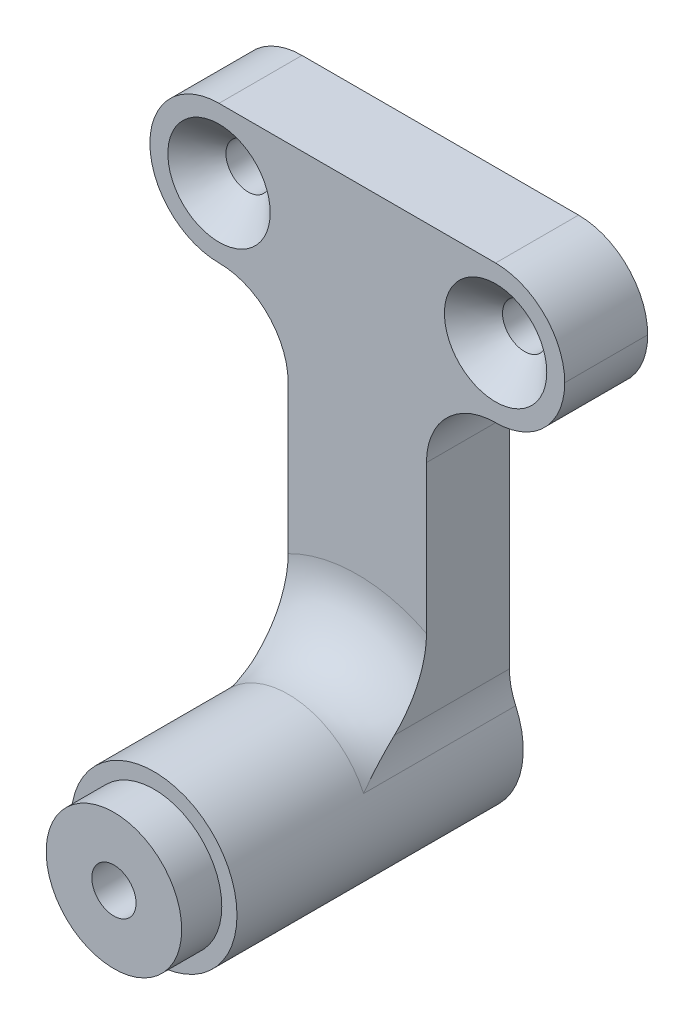
ISO-10303-21;
HEADER;
FILE_DESCRIPTION(('STEP AP214'),'2;1');
FILE_NAME('part.step','',(''),(''),'','','');
FILE_SCHEMA(('AUTOMOTIVE_DESIGN { 1 0 10303 214 1 1 1 1 }'));
ENDSEC;
DATA;
#1=APPLICATION_CONTEXT('core data for automotive mechanical design processes');
#2=APPLICATION_PROTOCOL_DEFINITION('international standard','automotive_design',2000,#1);
#3=PRODUCT_CONTEXT('',#1,'mechanical');
#4=PRODUCT('Part','Part','',(#3));
#5=PRODUCT_RELATED_PRODUCT_CATEGORY('part','',(#4));
#6=PRODUCT_DEFINITION_FORMATION('','',#4);
#7=PRODUCT_DEFINITION_CONTEXT('part definition',#1,'design');
#8=PRODUCT_DEFINITION('design','',#6,#7);
#9=PRODUCT_DEFINITION_SHAPE('','',#8);
#10=(LENGTH_UNIT() NAMED_UNIT(*) SI_UNIT(.MILLI.,.METRE.));
#11=(NAMED_UNIT(*) PLANE_ANGLE_UNIT() SI_UNIT($,.RADIAN.));
#12=(NAMED_UNIT(*) SI_UNIT($,.STERADIAN.) SOLID_ANGLE_UNIT());
#13=UNCERTAINTY_MEASURE_WITH_UNIT(LENGTH_MEASURE(1.E-05),#10,'distance_accuracy_value','');
#14=(GEOMETRIC_REPRESENTATION_CONTEXT(3) GLOBAL_UNCERTAINTY_ASSIGNED_CONTEXT((#13)) GLOBAL_UNIT_ASSIGNED_CONTEXT((#10,
#11,#12)) REPRESENTATION_CONTEXT('',''));
#15=CARTESIAN_POINT('',(0.,0.,0.));
#16=DIRECTION('',(0.,0.,1.));
#17=DIRECTION('',(1.,0.,0.));
#18=AXIS2_PLACEMENT_3D('',#15,#16,#17);
#19=CARTESIAN_POINT('',(-5.,25.5,6.));
#20=DIRECTION('',(1.,0.,0.));
#21=DIRECTION('',(0.,1.,0.));
#22=AXIS2_PLACEMENT_3D('',#19,#20,#21);
#23=PLANE('',#22);
#24=DIRECTION('',(0.,-1.,0.));
#25=VECTOR('',#24,1.);
#26=CARTESIAN_POINT('',(-5.,25.5,0.));
#27=LINE('',#26,#25);
#28=CARTESIAN_POINT('',(-5.,20.5,0.));
#29=VERTEX_POINT('',#28);
#30=CARTESIAN_POINT('',(-5.,4.58257569495584,0.));
#31=VERTEX_POINT('',#30);
#32=EDGE_CURVE('E158',#29,#31,#27,.T.);
#33=ORIENTED_EDGE('',*,*,#32,.T.);
#34=DIRECTION('',(0.,0.,1.));
#35=VECTOR('',#34,1.);
#36=CARTESIAN_POINT('',(-5.,4.58257569495584,6.));
#37=LINE('',#36,#35);
#38=CARTESIAN_POINT('',(-5.,4.58257569495584,8.3146211386906));
#39=VERTEX_POINT('',#38);
#40=EDGE_CURVE('E60',#31,#39,#37,.T.);
#41=ORIENTED_EDGE('',*,*,#40,.T.);
#42=CARTESIAN_POINT('',(-5.,4.58257569495584,8.3146211386906));
#43=CARTESIAN_POINT('',(-5.,4.6552647861898,8.23750160042584));
#44=CARTESIAN_POINT('',(-5.,4.72976065412573,8.16210048924519));
#45=CARTESIAN_POINT('',(-5.,4.88206573324877,8.01474392276265));
#46=CARTESIAN_POINT('',(-5.,4.95987443765592,7.94278794399533));
#47=CARTESIAN_POINT('',(-5.,5.11850866932962,7.80232344552039));
#48=CARTESIAN_POINT('',(-5.,5.1993334831774,7.73381411944536));
#49=CARTESIAN_POINT('',(-5.,5.3637931988913,7.60025998394195));
#50=CARTESIAN_POINT('',(-5.,5.44742823781353,7.53521534388919));
#51=CARTESIAN_POINT('',(-5.,5.7032791257637,7.34459485558813));
#52=CARTESIAN_POINT('',(-5.,5.87951408953155,7.22435036305058));
#53=CARTESIAN_POINT('',(-5.,6.24127379701053,6.99878108953864));
#54=CARTESIAN_POINT('',(-5.,6.42679923874401,6.89345743189593));
#55=CARTESIAN_POINT('',(-5.,6.80417711689646,6.69960267417584));
#56=CARTESIAN_POINT('',(-5.,6.9959510118619,6.61091902219559));
#57=CARTESIAN_POINT('',(-5.,7.38637633611028,6.45016272465897));
#58=CARTESIAN_POINT('',(-5.,7.58502835156561,6.37809149888701));
#59=CARTESIAN_POINT('',(-5.,7.98712060570804,6.25197253411151));
#60=CARTESIAN_POINT('',(-5.,8.19053869703774,6.19785435809875));
#61=CARTESIAN_POINT('',(-5.,8.60138001511579,6.10842916236575));
#62=CARTESIAN_POINT('',(-5.,8.80880052234525,6.07310980558581));
#63=CARTESIAN_POINT('',(-5.,9.14687158761785,6.03196346291126));
#64=CARTESIAN_POINT('',(-5.,9.27680263563566,6.0200314612469));
#65=CARTESIAN_POINT('',(-5.,9.53713188700292,6.00404921861072));
#66=CARTESIAN_POINT('',(-5.,9.66753003618686,5.99999809162991));
#67=CARTESIAN_POINT('',(-5.,9.79795897113271,5.99999999999999));
#68=B_SPLINE_CURVE_WITH_KNOTS('',3,(#42,#43,#44,#45,#46,#47,#48,#49,#50,#51,#52,#53,#54,#55,#56,
#57,#58,#59,#60,#61,#62,#63,#64,#65,#66,#67),.UNSPECIFIED.,.F.,.F.,(4,2,2,2,2,2,2,2,2,2,2,2,4),
(0.,0.317884772807158,0.635721090806707,0.95348269973983,1.27125982862603,1.91051057547664,
2.54980942348533,3.18292553369413,3.81609573325488,4.44675153329882,5.07699294233707,
5.4682066522473,5.85937637733179),.UNSPECIFIED.);
#69=CARTESIAN_POINT('',(-5.,9.79795897113271,6.));
#70=VERTEX_POINT('',#69);
#71=EDGE_CURVE('E188',#39,#70,#68,.T.);
#72=ORIENTED_EDGE('',*,*,#71,.T.);
#73=DIRECTION('',(0.,-1.,0.));
#74=VECTOR('',#73,1.);
#75=CARTESIAN_POINT('',(-5.,25.5,6.));
#76=LINE('',#75,#74);
#77=CARTESIAN_POINT('',(-5.,20.5,6.));
#78=VERTEX_POINT('',#77);
#79=EDGE_CURVE('E169',#78,#70,#76,.T.);
#80=ORIENTED_EDGE('',*,*,#79,.F.);
#81=DIRECTION('',(0.,0.,-1.));
#82=VECTOR('',#81,1.);
#83=CARTESIAN_POINT('',(-5.,20.5,0.));
#84=LINE('',#83,#82);
#85=EDGE_CURVE('E152',#78,#29,#84,.T.);
#86=ORIENTED_EDGE('',*,*,#85,.T.);
#87=EDGE_LOOP('',(#33,#41,#72,#80,#86));
#88=FACE_BOUND('',#87,.T.);
#89=ADVANCED_FACE('F33',(#88),#23,.F.);
#90=CARTESIAN_POINT('',(0.,0.,6.));
#91=DIRECTION('',(0.,0.,-1.));
#92=DIRECTION('',(-1.,0.,0.));
#93=AXIS2_PLACEMENT_3D('',#90,#91,#92);
#94=CYLINDRICAL_SURFACE('',#93,6.);
#95=CARTESIAN_POINT('',(0.,0.,11.));
#96=DIRECTION('',(0.,0.,1.));
#97=DIRECTION('',(1.,0.,0.));
#98=AXIS2_PLACEMENT_3D('',#95,#96,#97);
#99=CIRCLE('',#98,6.);
#100=CARTESIAN_POINT('',(5.45454545454546,2.49958674270319,11.));
#101=VERTEX_POINT('',#100);
#102=CARTESIAN_POINT('',(-5.45454545454546,2.49958674270318,11.));
#103=VERTEX_POINT('',#102);
#104=EDGE_CURVE('E151',#101,#103,#99,.T.);
#105=ORIENTED_EDGE('',*,*,#104,.T.);
#106=DIRECTION('',(0.,0.,-1.));
#107=VECTOR('',#106,1.);
#108=CARTESIAN_POINT('',(-5.45454545454546,2.49958674270318,6.));
#109=LINE('',#108,#107);
#110=CARTESIAN_POINT('',(-5.45454545454546,2.49958674270318,0.));
#111=VERTEX_POINT('',#110);
#112=EDGE_CURVE('E135',#103,#111,#109,.T.);
#113=ORIENTED_EDGE('',*,*,#112,.T.);
#114=CARTESIAN_POINT('',(0.,0.,0.));
#115=DIRECTION('',(0.,0.,1.));
#116=DIRECTION('',(1.,0.,0.));
#117=AXIS2_PLACEMENT_3D('',#114,#115,#116);
#118=CIRCLE('',#117,6.);
#119=CARTESIAN_POINT('',(5.45454545454546,2.49958674270319,0.));
#120=VERTEX_POINT('',#119);
#121=EDGE_CURVE('E148',#111,#120,#118,.T.);
#122=ORIENTED_EDGE('',*,*,#121,.T.);
#123=DIRECTION('',(0.,0.,-1.));
#124=VECTOR('',#123,1.);
#125=CARTESIAN_POINT('',(5.45454545454546,2.49958674270319,6.));
#126=LINE('',#125,#124);
#127=EDGE_CURVE('E153',#120,#101,#126,.F.);
#128=ORIENTED_EDGE('',*,*,#127,.T.);
#129=EDGE_LOOP('',(#105,#113,#122,#128));
#130=FACE_BOUND('',#129,.T.);
#131=CARTESIAN_POINT('',(0.,0.,20.7));
#132=DIRECTION('',(0.,0.,1.));
#133=DIRECTION('',(1.,0.,0.));
#134=AXIS2_PLACEMENT_3D('',#131,#132,#133);
#135=CIRCLE('',#134,6.);
#136=CARTESIAN_POINT('',(6.,0.,20.7));
#137=VERTEX_POINT('',#136);
#138=EDGE_CURVE('E163',#137,#137,#135,.T.);
#139=ORIENTED_EDGE('',*,*,#138,.F.);
#140=EDGE_LOOP('',(#139));
#141=FACE_BOUND('',#140,.T.);
#142=ADVANCED_FACE('F146',(#130,#141),#94,.T.);
#143=CARTESIAN_POINT('',(5.,25.5,6.));
#144=DIRECTION('',(-1.,0.,0.));
#145=DIRECTION('',(0.,-1.,0.));
#146=AXIS2_PLACEMENT_3D('',#143,#144,#145);
#147=PLANE('',#146);
#148=DIRECTION('',(0.,1.,0.));
#149=VECTOR('',#148,1.);
#150=CARTESIAN_POINT('',(5.,25.5,6.));
#151=LINE('',#150,#149);
#152=CARTESIAN_POINT('',(5.,9.79795897113271,6.));
#153=VERTEX_POINT('',#152);
#154=CARTESIAN_POINT('',(5.,20.5,6.));
#155=VERTEX_POINT('',#154);
#156=EDGE_CURVE('E175',#153,#155,#151,.T.);
#157=ORIENTED_EDGE('',*,*,#156,.F.);
#158=CARTESIAN_POINT('',(5.,9.79795897113271,6.));
#159=CARTESIAN_POINT('',(5.,9.58397828175802,5.99997321738556));
#160=CARTESIAN_POINT('',(5.,9.37009614250347,6.01089460436296));
#161=CARTESIAN_POINT('',(5.,8.94459327034117,6.05350764672315));
#162=CARTESIAN_POINT('',(5.,8.73297065212745,6.08518034166478));
#163=CARTESIAN_POINT('',(5.,8.31419081681732,6.16806764934972));
#164=CARTESIAN_POINT('',(5.,8.10702355090237,6.21923200226472));
#165=CARTESIAN_POINT('',(5.,7.69809077582581,6.33991578528085));
#166=CARTESIAN_POINT('',(5.,7.49632598403892,6.4094376398251));
#167=CARTESIAN_POINT('',(5.,7.12004415347954,6.55757810836522));
#168=CARTESIAN_POINT('',(5.,6.94486259267602,6.63451979055687));
#169=CARTESIAN_POINT('',(5.,6.60080764729448,6.80139128824164));
#170=CARTESIAN_POINT('',(5.,6.43193408925892,6.89132074626534));
#171=CARTESIAN_POINT('',(5.,6.10142927802503,7.08338355609127));
#172=CARTESIAN_POINT('',(5.,5.9397933821299,7.18550892587965));
#173=CARTESIAN_POINT('',(5.,5.62455710656075,7.40139465082614));
#174=CARTESIAN_POINT('',(5.,5.47095424779803,7.51515138399978));
#175=CARTESIAN_POINT('',(5.,5.19095325117081,7.73936784714088));
#176=CARTESIAN_POINT('',(5.,5.06352256504313,7.84853617373721));
#177=CARTESIAN_POINT('',(5.,4.87840835199579,8.01860472094349));
#178=CARTESIAN_POINT('',(5.,4.81775712790713,8.07629603119259));
#179=CARTESIAN_POINT('',(5.,4.69855206720733,8.19383854729498));
#180=CARTESIAN_POINT('',(5.,4.63999883002076,8.25369036078257));
#181=CARTESIAN_POINT('',(5.,4.58257569495676,8.31462113869176));
#182=B_SPLINE_CURVE_WITH_KNOTS('',3,(#158,#159,#160,#161,#162,#163,#164,#165,#166,#167,#168,
#169,#170,#171,#172,#173,#174,#175,#176,#177,#178,#179,#180,#181),.UNSPECIFIED.,.F.,.F.,(4,2,2,
2,2,2,2,2,2,2,2,4),(0.,0.641520535387512,1.2824557302669,1.92174931952112,2.56112738142607,
3.13458377232832,3.70802438269323,4.28109172199889,4.85398114958619,5.35696676594287,
5.6080399606954,5.85918432769637),.UNSPECIFIED.);
#183=CARTESIAN_POINT('',(5.,4.58257569495584,8.3146211386906));
#184=VERTEX_POINT('',#183);
#185=EDGE_CURVE('E46',#153,#184,#182,.T.);
#186=ORIENTED_EDGE('',*,*,#185,.T.);
#187=DIRECTION('',(0.,0.,1.));
#188=VECTOR('',#187,1.);
#189=CARTESIAN_POINT('',(5.,4.58257569495584,0.));
#190=LINE('',#189,#188);
#191=CARTESIAN_POINT('',(5.,4.58257569495584,0.));
#192=VERTEX_POINT('',#191);
#193=EDGE_CURVE('E52',#184,#192,#190,.F.);
#194=ORIENTED_EDGE('',*,*,#193,.T.);
#195=DIRECTION('',(0.,1.,0.));
#196=VECTOR('',#195,1.);
#197=CARTESIAN_POINT('',(5.,25.5,0.));
#198=LINE('',#197,#196);
#199=CARTESIAN_POINT('',(5.,20.5,0.));
#200=VERTEX_POINT('',#199);
#201=EDGE_CURVE('E157',#192,#200,#198,.T.);
#202=ORIENTED_EDGE('',*,*,#201,.T.);
#203=DIRECTION('',(0.,0.,-1.));
#204=VECTOR('',#203,1.);
#205=CARTESIAN_POINT('',(5.,20.5,6.));
#206=LINE('',#205,#204);
#207=EDGE_CURVE('E279',#200,#155,#206,.F.);
#208=ORIENTED_EDGE('',*,*,#207,.T.);
#209=EDGE_LOOP('',(#157,#186,#194,#202,#208));
#210=FACE_BOUND('',#209,.T.);
#211=ADVANCED_FACE('F242',(#210),#147,.F.);
#212=CARTESIAN_POINT('',(-15.,35.5,6.));
#213=DIRECTION('',(0.,-1.,0.));
#214=DIRECTION('',(1.,0.,0.));
#215=AXIS2_PLACEMENT_3D('',#212,#213,#214);
#216=PLANE('',#215);
#217=DIRECTION('',(-1.,0.,0.));
#218=VECTOR('',#217,1.);
#219=CARTESIAN_POINT('',(-15.,35.5,6.));
#220=LINE('',#219,#218);
#221=CARTESIAN_POINT('',(10.,35.5,6.));
#222=VERTEX_POINT('',#221);
#223=CARTESIAN_POINT('',(-10.,35.5,6.));
#224=VERTEX_POINT('',#223);
#225=EDGE_CURVE('E178',#222,#224,#220,.T.);
#226=ORIENTED_EDGE('',*,*,#225,.F.);
#227=DIRECTION('',(0.,0.,-1.));
#228=VECTOR('',#227,1.);
#229=CARTESIAN_POINT('',(10.,35.5,6.));
#230=LINE('',#229,#228);
#231=CARTESIAN_POINT('',(10.,35.5,0.));
#232=VERTEX_POINT('',#231);
#233=EDGE_CURVE('E141',#222,#232,#230,.T.);
#234=ORIENTED_EDGE('',*,*,#233,.T.);
#235=DIRECTION('',(-1.,0.,0.));
#236=VECTOR('',#235,1.);
#237=CARTESIAN_POINT('',(-15.,35.5,0.));
#238=LINE('',#237,#236);
#239=CARTESIAN_POINT('',(-10.,35.5,0.));
#240=VERTEX_POINT('',#239);
#241=EDGE_CURVE('E161',#232,#240,#238,.T.);
#242=ORIENTED_EDGE('',*,*,#241,.T.);
#243=DIRECTION('',(0.,0.,-1.));
#244=VECTOR('',#243,1.);
#245=CARTESIAN_POINT('',(-10.,35.5,6.));
#246=LINE('',#245,#244);
#247=EDGE_CURVE('E299',#240,#224,#246,.F.);
#248=ORIENTED_EDGE('',*,*,#247,.T.);
#249=EDGE_LOOP('',(#226,#234,#242,#248));
#250=FACE_BOUND('',#249,.T.);
#251=ADVANCED_FACE('F249',(#250),#216,.F.);
#252=CARTESIAN_POINT('',(0.,0.,6.));
#253=DIRECTION('',(0.,0.,1.));
#254=DIRECTION('',(1.,0.,0.));
#255=AXIS2_PLACEMENT_3D('',#252,#253,#254);
#256=PLANE('',#255);
#257=CARTESIAN_POINT('',(10.,30.5,6.));
#258=DIRECTION('',(0.,0.,1.));
#259=DIRECTION('',(1.,0.,0.));
#260=AXIS2_PLACEMENT_3D('',#257,#258,#259);
#261=CIRCLE('',#260,3.7);
#262=CARTESIAN_POINT('',(13.7,30.5,6.));
#263=VERTEX_POINT('',#262);
#264=EDGE_CURVE('E329',#263,#263,#261,.F.);
#265=ORIENTED_EDGE('',*,*,#264,.T.);
#266=EDGE_LOOP('',(#265));
#267=FACE_BOUND('',#266,.T.);
#268=CARTESIAN_POINT('',(-10.,30.5,6.));
#269=DIRECTION('',(0.,0.,1.));
#270=DIRECTION('',(1.,0.,0.));
#271=AXIS2_PLACEMENT_3D('',#268,#269,#270);
#272=CIRCLE('',#271,3.7);
#273=CARTESIAN_POINT('',(-6.3,30.5,6.));
#274=VERTEX_POINT('',#273);
#275=EDGE_CURVE('E326',#274,#274,#272,.F.);
#276=ORIENTED_EDGE('',*,*,#275,.T.);
#277=EDGE_LOOP('',(#276));
#278=FACE_BOUND('',#277,.T.);
#279=ORIENTED_EDGE('',*,*,#79,.T.);
#280=CARTESIAN_POINT('',(0.,0.,6.));
#281=DIRECTION('',(0.,0.,1.));
#282=DIRECTION('',(1.,0.,0.));
#283=AXIS2_PLACEMENT_3D('',#280,#281,#282);
#284=CIRCLE('',#283,11.);
#285=EDGE_CURVE('E180',#70,#153,#284,.F.);
#286=ORIENTED_EDGE('',*,*,#285,.T.);
#287=ORIENTED_EDGE('',*,*,#156,.T.);
#288=CARTESIAN_POINT('',(10.,20.5,6.));
#289=DIRECTION('',(0.,0.,1.));
#290=DIRECTION('',(1.,0.,0.));
#291=AXIS2_PLACEMENT_3D('',#288,#289,#290);
#292=CIRCLE('',#291,5.);
#293=CARTESIAN_POINT('',(10.,25.5,6.));
#294=VERTEX_POINT('',#293);
#295=EDGE_CURVE('E306',#155,#294,#292,.F.);
#296=ORIENTED_EDGE('',*,*,#295,.T.);
#297=CARTESIAN_POINT('',(10.,30.5,6.));
#298=DIRECTION('',(0.,0.,1.));
#299=DIRECTION('',(1.,0.,0.));
#300=AXIS2_PLACEMENT_3D('',#297,#298,#299);
#301=CIRCLE('',#300,5.);
#302=CARTESIAN_POINT('',(15.,30.5,6.));
#303=VERTEX_POINT('',#302);
#304=EDGE_CURVE('E297',#294,#303,#301,.T.);
#305=ORIENTED_EDGE('',*,*,#304,.T.);
#306=CARTESIAN_POINT('',(10.,30.5,6.));
#307=DIRECTION('',(0.,0.,1.));
#308=DIRECTION('',(1.,0.,0.));
#309=AXIS2_PLACEMENT_3D('',#306,#307,#308);
#310=CIRCLE('',#309,5.);
#311=EDGE_CURVE('E295',#303,#222,#310,.T.);
#312=ORIENTED_EDGE('',*,*,#311,.T.);
#313=ORIENTED_EDGE('',*,*,#225,.T.);
#314=CARTESIAN_POINT('',(-10.,30.5,6.));
#315=DIRECTION('',(0.,0.,1.));
#316=DIRECTION('',(1.,0.,0.));
#317=AXIS2_PLACEMENT_3D('',#314,#315,#316);
#318=CIRCLE('',#317,5.);
#319=CARTESIAN_POINT('',(-15.,30.5,6.));
#320=VERTEX_POINT('',#319);
#321=EDGE_CURVE('E293',#224,#320,#318,.T.);
#322=ORIENTED_EDGE('',*,*,#321,.T.);
#323=CARTESIAN_POINT('',(-10.,30.5,6.));
#324=DIRECTION('',(0.,0.,1.));
#325=DIRECTION('',(1.,0.,0.));
#326=AXIS2_PLACEMENT_3D('',#323,#324,#325);
#327=CIRCLE('',#326,5.);
#328=CARTESIAN_POINT('',(-10.,25.5,6.));
#329=VERTEX_POINT('',#328);
#330=EDGE_CURVE('E291',#320,#329,#327,.T.);
#331=ORIENTED_EDGE('',*,*,#330,.T.);
#332=CARTESIAN_POINT('',(-10.,20.5,6.));
#333=DIRECTION('',(0.,0.,1.));
#334=DIRECTION('',(1.,0.,0.));
#335=AXIS2_PLACEMENT_3D('',#332,#333,#334);
#336=CIRCLE('',#335,5.);
#337=EDGE_CURVE('E266',#329,#78,#336,.F.);
#338=ORIENTED_EDGE('',*,*,#337,.T.);
#339=EDGE_LOOP('',(#279,#286,#287,#296,#305,#312,#313,#322,#331,#338));
#340=FACE_BOUND('',#339,.T.);
#341=ADVANCED_FACE('F264',(#267,#278,#340),#256,.T.);
#342=CARTESIAN_POINT('',(0.,0.,0.));
#343=DIRECTION('',(0.,0.,1.));
#344=DIRECTION('',(1.,0.,0.));
#345=AXIS2_PLACEMENT_3D('',#342,#343,#344);
#346=PLANE('',#345);
#347=CARTESIAN_POINT('',(10.,30.5,0.));
#348=DIRECTION('',(0.,0.,1.));
#349=DIRECTION('',(1.,0.,0.));
#350=AXIS2_PLACEMENT_3D('',#347,#348,#349);
#351=CIRCLE('',#350,1.6);
#352=CARTESIAN_POINT('',(11.6,30.5,0.));
#353=VERTEX_POINT('',#352);
#354=EDGE_CURVE('E274',#353,#353,#351,.T.);
#355=ORIENTED_EDGE('',*,*,#354,.T.);
#356=EDGE_LOOP('',(#355));
#357=FACE_BOUND('',#356,.T.);
#358=CARTESIAN_POINT('',(-10.,30.5,0.));
#359=DIRECTION('',(0.,0.,1.));
#360=DIRECTION('',(1.,0.,0.));
#361=AXIS2_PLACEMENT_3D('',#358,#359,#360);
#362=CIRCLE('',#361,1.6);
#363=CARTESIAN_POINT('',(-8.4,30.5,0.));
#364=VERTEX_POINT('',#363);
#365=EDGE_CURVE('E341',#364,#364,#362,.T.);
#366=ORIENTED_EDGE('',*,*,#365,.T.);
#367=EDGE_LOOP('',(#366));
#368=FACE_BOUND('',#367,.T.);
#369=CARTESIAN_POINT('',(0.,0.,0.));
#370=DIRECTION('',(0.,0.,1.));
#371=DIRECTION('',(1.,0.,0.));
#372=AXIS2_PLACEMENT_3D('',#369,#370,#371);
#373=CIRCLE('',#372,3.70000000000001);
#374=CARTESIAN_POINT('',(3.70000000000001,0.,0.));
#375=VERTEX_POINT('',#374);
#376=EDGE_CURVE('E268',#375,#375,#373,.T.);
#377=ORIENTED_EDGE('',*,*,#376,.T.);
#378=EDGE_LOOP('',(#377));
#379=FACE_BOUND('',#378,.T.);
#380=CARTESIAN_POINT('',(10.,30.5,0.));
#381=DIRECTION('',(0.,0.,1.));
#382=DIRECTION('',(1.,0.,0.));
#383=AXIS2_PLACEMENT_3D('',#380,#381,#382);
#384=CIRCLE('',#383,5.);
#385=CARTESIAN_POINT('',(15.,30.5,0.));
#386=VERTEX_POINT('',#385);
#387=EDGE_CURVE('E287',#232,#386,#384,.F.);
#388=ORIENTED_EDGE('',*,*,#387,.T.);
#389=CARTESIAN_POINT('',(10.,30.5,0.));
#390=DIRECTION('',(0.,0.,1.));
#391=DIRECTION('',(1.,0.,0.));
#392=AXIS2_PLACEMENT_3D('',#389,#390,#391);
#393=CIRCLE('',#392,5.);
#394=CARTESIAN_POINT('',(10.,25.5,0.));
#395=VERTEX_POINT('',#394);
#396=EDGE_CURVE('E289',#386,#395,#393,.F.);
#397=ORIENTED_EDGE('',*,*,#396,.T.);
#398=CARTESIAN_POINT('',(10.,20.5,0.));
#399=DIRECTION('',(0.,0.,1.));
#400=DIRECTION('',(1.,0.,0.));
#401=AXIS2_PLACEMENT_3D('',#398,#399,#400);
#402=CIRCLE('',#401,5.);
#403=EDGE_CURVE('E304',#395,#200,#402,.T.);
#404=ORIENTED_EDGE('',*,*,#403,.T.);
#405=ORIENTED_EDGE('',*,*,#201,.F.);
#406=CARTESIAN_POINT('',(10.,4.58257569495584,0.));
#407=DIRECTION('',(0.,0.,1.));
#408=DIRECTION('',(1.,0.,0.));
#409=AXIS2_PLACEMENT_3D('',#406,#407,#408);
#410=CIRCLE('',#409,5.);
#411=EDGE_CURVE('E140',#192,#120,#410,.T.);
#412=ORIENTED_EDGE('',*,*,#411,.T.);
#413=ORIENTED_EDGE('',*,*,#121,.F.);
#414=CARTESIAN_POINT('',(-10.,4.58257569495584,0.));
#415=DIRECTION('',(0.,0.,1.));
#416=DIRECTION('',(1.,0.,0.));
#417=AXIS2_PLACEMENT_3D('',#414,#415,#416);
#418=CIRCLE('',#417,5.);
#419=EDGE_CURVE('E132',#111,#31,#418,.T.);
#420=ORIENTED_EDGE('',*,*,#419,.T.);
#421=ORIENTED_EDGE('',*,*,#32,.F.);
#422=CARTESIAN_POINT('',(-10.,20.5,0.));
#423=DIRECTION('',(0.,0.,1.));
#424=DIRECTION('',(1.,0.,0.));
#425=AXIS2_PLACEMENT_3D('',#422,#423,#424);
#426=CIRCLE('',#425,5.);
#427=CARTESIAN_POINT('',(-10.,25.5,0.));
#428=VERTEX_POINT('',#427);
#429=EDGE_CURVE('E308',#29,#428,#426,.T.);
#430=ORIENTED_EDGE('',*,*,#429,.T.);
#431=CARTESIAN_POINT('',(-10.,30.5,0.));
#432=DIRECTION('',(0.,0.,1.));
#433=DIRECTION('',(1.,0.,0.));
#434=AXIS2_PLACEMENT_3D('',#431,#432,#433);
#435=CIRCLE('',#434,5.);
#436=CARTESIAN_POINT('',(-15.,30.5,0.));
#437=VERTEX_POINT('',#436);
#438=EDGE_CURVE('E283',#428,#437,#435,.F.);
#439=ORIENTED_EDGE('',*,*,#438,.T.);
#440=CARTESIAN_POINT('',(-10.,30.5,0.));
#441=DIRECTION('',(0.,0.,1.));
#442=DIRECTION('',(1.,0.,0.));
#443=AXIS2_PLACEMENT_3D('',#440,#441,#442);
#444=CIRCLE('',#443,5.);
#445=EDGE_CURVE('E285',#437,#240,#444,.F.);
#446=ORIENTED_EDGE('',*,*,#445,.T.);
#447=ORIENTED_EDGE('',*,*,#241,.F.);
#448=EDGE_LOOP('',(#388,#397,#404,#405,#412,#413,#420,#421,#430,#439,#446,#447));
#449=FACE_BOUND('',#448,.T.);
#450=ADVANCED_FACE('F155',(#357,#368,#379,#449),#346,.F.);
#451=CARTESIAN_POINT('',(0.,0.,20.7));
#452=DIRECTION('',(0.,0.,1.));
#453=DIRECTION('',(1.,0.,0.));
#454=AXIS2_PLACEMENT_3D('',#451,#452,#453);
#455=PLANE('',#454);
#456=CARTESIAN_POINT('',(0.,0.,20.7));
#457=DIRECTION('',(0.,0.,1.));
#458=DIRECTION('',(1.,0.,0.));
#459=AXIS2_PLACEMENT_3D('',#456,#457,#458);
#460=CIRCLE('',#459,4.9);
#461=CARTESIAN_POINT('',(4.9,0.,20.7));
#462=VERTEX_POINT('',#461);
#463=EDGE_CURVE('E345',#462,#462,#460,.T.);
#464=ORIENTED_EDGE('',*,*,#463,.F.);
#465=EDGE_LOOP('',(#464));
#466=FACE_BOUND('',#465,.T.);
#467=ORIENTED_EDGE('',*,*,#138,.T.);
#468=EDGE_LOOP('',(#467));
#469=FACE_BOUND('',#468,.T.);
#470=ADVANCED_FACE('F367',(#466,#469),#455,.T.);
#471=CARTESIAN_POINT('',(0.,0.,23.6));
#472=DIRECTION('',(0.,0.,-1.));
#473=DIRECTION('',(-1.,0.,0.));
#474=AXIS2_PLACEMENT_3D('',#471,#472,#473);
#475=CYLINDRICAL_SURFACE('',#474,4.9);
#476=CARTESIAN_POINT('',(0.,0.,23.6));
#477=DIRECTION('',(0.,0.,1.));
#478=DIRECTION('',(1.,0.,0.));
#479=AXIS2_PLACEMENT_3D('',#476,#477,#478);
#480=CIRCLE('',#479,4.9);
#481=CARTESIAN_POINT('',(4.9,0.,23.6));
#482=VERTEX_POINT('',#481);
#483=EDGE_CURVE('E356',#482,#482,#480,.T.);
#484=ORIENTED_EDGE('',*,*,#483,.F.);
#485=EDGE_LOOP('',(#484));
#486=FACE_BOUND('',#485,.T.);
#487=ORIENTED_EDGE('',*,*,#463,.T.);
#488=EDGE_LOOP('',(#487));
#489=FACE_BOUND('',#488,.T.);
#490=ADVANCED_FACE('F364',(#486,#489),#475,.T.);
#491=CARTESIAN_POINT('',(0.,0.,23.6));
#492=DIRECTION('',(0.,0.,1.));
#493=DIRECTION('',(1.,0.,0.));
#494=AXIS2_PLACEMENT_3D('',#491,#492,#493);
#495=PLANE('',#494);
#496=CARTESIAN_POINT('',(0.,0.,23.6));
#497=DIRECTION('',(0.,0.,-1.));
#498=DIRECTION('',(-1.,0.,0.));
#499=AXIS2_PLACEMENT_3D('',#496,#497,#498);
#500=CIRCLE('',#499,1.6);
#501=CARTESIAN_POINT('',(-1.6,0.,23.6));
#502=VERTEX_POINT('',#501);
#503=EDGE_CURVE('E343',#502,#502,#500,.T.);
#504=ORIENTED_EDGE('',*,*,#503,.T.);
#505=EDGE_LOOP('',(#504));
#506=FACE_BOUND('',#505,.T.);
#507=ORIENTED_EDGE('',*,*,#483,.T.);
#508=EDGE_LOOP('',(#507));
#509=FACE_BOUND('',#508,.T.);
#510=ADVANCED_FACE('F362',(#506,#509),#495,.T.);
#511=CARTESIAN_POINT('',(0.,0.,23.6));
#512=DIRECTION('',(0.,0.,-1.));
#513=DIRECTION('',(-1.,0.,0.));
#514=AXIS2_PLACEMENT_3D('',#511,#512,#513);
#515=CYLINDRICAL_SURFACE('',#514,1.6);
#516=CARTESIAN_POINT('',(0.,0.,2.1));
#517=DIRECTION('',(0.,0.,1.));
#518=DIRECTION('',(1.,0.,0.));
#519=AXIS2_PLACEMENT_3D('',#516,#517,#518);
#520=CIRCLE('',#519,1.6);
#521=CARTESIAN_POINT('',(1.6,0.,2.1));
#522=VERTEX_POINT('',#521);
#523=EDGE_CURVE('E271',#522,#522,#520,.F.);
#524=ORIENTED_EDGE('',*,*,#523,.T.);
#525=EDGE_LOOP('',(#524));
#526=FACE_BOUND('',#525,.T.);
#527=ORIENTED_EDGE('',*,*,#503,.F.);
#528=EDGE_LOOP('',(#527));
#529=FACE_BOUND('',#528,.T.);
#530=ADVANCED_FACE('F401',(#526,#529),#515,.F.);
#531=CARTESIAN_POINT('',(0.,0.,2.1));
#532=DIRECTION('',(0.,0.,-1.));
#533=DIRECTION('',(-1.,0.,0.));
#534=AXIS2_PLACEMENT_3D('',#531,#532,#533);
#535=CONICAL_SURFACE('',#534,1.6,0.78539816339745);
#536=ORIENTED_EDGE('',*,*,#376,.F.);
#537=EDGE_LOOP('',(#536));
#538=FACE_BOUND('',#537,.T.);
#539=ORIENTED_EDGE('',*,*,#523,.F.);
#540=EDGE_LOOP('',(#539));
#541=FACE_BOUND('',#540,.T.);
#542=ADVANCED_FACE('F198',(#538,#541),#535,.F.);
#543=CARTESIAN_POINT('',(-10.,30.5,-2.49999999998515E-05));
#544=DIRECTION('',(0.,0.,1.));
#545=DIRECTION('',(1.,0.,0.));
#546=AXIS2_PLACEMENT_3D('',#543,#544,#545);
#547=CYLINDRICAL_SURFACE('',#546,1.6);
#548=CARTESIAN_POINT('',(-10.,30.5,3.90000000000001));
#549=DIRECTION('',(0.,0.,1.));
#550=DIRECTION('',(1.,0.,0.));
#551=AXIS2_PLACEMENT_3D('',#548,#549,#550);
#552=CIRCLE('',#551,1.6);
#553=CARTESIAN_POINT('',(-8.4,30.5,3.90000000000001));
#554=VERTEX_POINT('',#553);
#555=EDGE_CURVE('E331',#554,#554,#552,.T.);
#556=ORIENTED_EDGE('',*,*,#555,.T.);
#557=EDGE_LOOP('',(#556));
#558=FACE_BOUND('',#557,.T.);
#559=ORIENTED_EDGE('',*,*,#365,.F.);
#560=EDGE_LOOP('',(#559));
#561=FACE_BOUND('',#560,.T.);
#562=ADVANCED_FACE('F335',(#558,#561),#547,.F.);
#563=CARTESIAN_POINT('',(10.,30.5,-2.49999999998515E-05));
#564=DIRECTION('',(0.,0.,1.));
#565=DIRECTION('',(1.,0.,0.));
#566=AXIS2_PLACEMENT_3D('',#563,#564,#565);
#567=CYLINDRICAL_SURFACE('',#566,1.6);
#568=CARTESIAN_POINT('',(10.,30.5,3.90000000000001));
#569=DIRECTION('',(0.,0.,1.));
#570=DIRECTION('',(1.,0.,0.));
#571=AXIS2_PLACEMENT_3D('',#568,#569,#570);
#572=CIRCLE('',#571,1.6);
#573=CARTESIAN_POINT('',(11.6,30.5,3.90000000000001));
#574=VERTEX_POINT('',#573);
#575=EDGE_CURVE('E311',#574,#574,#572,.T.);
#576=ORIENTED_EDGE('',*,*,#575,.T.);
#577=EDGE_LOOP('',(#576));
#578=FACE_BOUND('',#577,.T.);
#579=ORIENTED_EDGE('',*,*,#354,.F.);
#580=EDGE_LOOP('',(#579));
#581=FACE_BOUND('',#580,.T.);
#582=ADVANCED_FACE('F197',(#578,#581),#567,.F.);
#583=CARTESIAN_POINT('',(-10.,4.58257569495584,6.));
#584=DIRECTION('',(0.,0.,-1.));
#585=DIRECTION('',(-1.,0.,0.));
#586=AXIS2_PLACEMENT_3D('',#583,#584,#585);
#587=CYLINDRICAL_SURFACE('',#586,5.);
#588=ORIENTED_EDGE('',*,*,#112,.F.);
#589=CARTESIAN_POINT('',(-5.,4.58257569495584,8.3146211386906));
#590=CARTESIAN_POINT('',(-5.0000169453672,4.4857019960034,8.41742765495932));
#591=CARTESIAN_POINT('',(-5.00281525112331,4.39047651623999,8.52174185848241));
#592=CARTESIAN_POINT('',(-5.01352747482948,4.20319661450251,8.73285153461739));
#593=CARTESIAN_POINT('',(-5.02143926373678,4.11114088956754,8.83964595673642));
#594=CARTESIAN_POINT('',(-5.04192144162434,3.93008899214002,9.05515618479692));
#595=CARTESIAN_POINT('',(-5.05448697598095,3.84108973659197,9.16386987647584));
#596=CARTESIAN_POINT('',(-5.08395581644583,3.6658428980283,9.38292466975833));
#597=CARTESIAN_POINT('',(-5.10085962410895,3.57959563447208,9.49326595813985));
#598=CARTESIAN_POINT('',(-5.15859964179582,3.32054563816766,9.83154849091834));
#599=CARTESIAN_POINT('',(-5.20594709803617,3.15179446941815,10.061502798485));
#600=CARTESIAN_POINT('',(-5.31655798405125,2.82320173820167,10.5238584895985));
#601=CARTESIAN_POINT('',(-5.37981965018873,2.66335919086374,10.7562595992544));
#602=CARTESIAN_POINT('',(-5.4522141943543,2.50467964628952,10.9924160610526));
#603=CARTESIAN_POINT('',(-5.45337876310639,2.50213270195363,10.9962080381701));
#604=CARTESIAN_POINT('',(-5.45454545454545,2.49958674270318,11.));
#605=B_SPLINE_CURVE_WITH_KNOTS('',3,(#589,#590,#591,#592,#593,#594,#595,#596,#597,#598,#599,
#600,#601,#602,#603,#604),.UNSPECIFIED.,.F.,.F.,(4,2,2,2,2,2,2,4),(0.,0.423679732914144,
0.847183176663145,1.27024607517481,1.69335790672747,2.56005246322411,3.42665101357556,
3.44079315096057),.UNSPECIFIED.);
#606=EDGE_CURVE('E182',#103,#39,#605,.F.);
#607=ORIENTED_EDGE('',*,*,#606,.T.);
#608=ORIENTED_EDGE('',*,*,#40,.F.);
#609=ORIENTED_EDGE('',*,*,#419,.F.);
#610=EDGE_LOOP('',(#588,#607,#608,#609));
#611=FACE_BOUND('',#610,.T.);
#612=ADVANCED_FACE('F134',(#611),#587,.F.);
#613=CARTESIAN_POINT('',(10.,4.58257569495584,6.));
#614=DIRECTION('',(0.,0.,-1.));
#615=DIRECTION('',(-1.,0.,0.));
#616=AXIS2_PLACEMENT_3D('',#613,#614,#615);
#617=CYLINDRICAL_SURFACE('',#616,5.);
#618=ORIENTED_EDGE('',*,*,#193,.F.);
#619=CARTESIAN_POINT('',(5.,4.58257569495584,8.3146211386906));
#620=CARTESIAN_POINT('',(5.00001694536721,4.48570199600338,8.41742765495933));
#621=CARTESIAN_POINT('',(5.00281525112331,4.39047651623997,8.52174185848243));
#622=CARTESIAN_POINT('',(5.01352747482948,4.20319661450247,8.73285153461744));
#623=CARTESIAN_POINT('',(5.02143926373679,4.11114088956749,8.83964595673649));
#624=CARTESIAN_POINT('',(5.04192144162435,3.93008899213996,9.05515618479699));
#625=CARTESIAN_POINT('',(5.05448697598096,3.84108973659191,9.16386987647589));
#626=CARTESIAN_POINT('',(5.08395581644584,3.66584289802828,9.38292466975837));
#627=CARTESIAN_POINT('',(5.10085962410894,3.5795956344721,9.49326595813991));
#628=CARTESIAN_POINT('',(5.15859964179586,3.32054563816758,9.8315484909183));
#629=CARTESIAN_POINT('',(5.20594709803635,3.15179446941774,10.0615027984846));
#630=CARTESIAN_POINT('',(5.31655798405108,2.82320173820207,10.5238584895988));
#631=CARTESIAN_POINT('',(5.37981965018806,2.66335919086525,10.7562595992557));
#632=CARTESIAN_POINT('',(5.45221419435428,2.50467964628956,10.9924160610527));
#633=CARTESIAN_POINT('',(5.45337876310638,2.50213270195365,10.9962080381701));
#634=CARTESIAN_POINT('',(5.45454545454545,2.49958674270318,11.));
#635=B_SPLINE_CURVE_WITH_KNOTS('',3,(#619,#620,#621,#622,#623,#624,#625,#626,#627,#628,#629,
#630,#631,#632,#633,#634),.UNSPECIFIED.,.F.,.F.,(4,2,2,2,2,2,2,4),(0.,0.423679732914201,
0.847183176663248,1.27024607517487,1.69335790672749,2.56005246322411,3.42665101357557,
3.44079315096057),.UNSPECIFIED.);
#636=EDGE_CURVE('E11',#184,#101,#635,.T.);
#637=ORIENTED_EDGE('',*,*,#636,.T.);
#638=ORIENTED_EDGE('',*,*,#127,.F.);
#639=ORIENTED_EDGE('',*,*,#411,.F.);
#640=EDGE_LOOP('',(#618,#637,#638,#639));
#641=FACE_BOUND('',#640,.T.);
#642=ADVANCED_FACE('F196',(#641),#617,.F.);
#643=CARTESIAN_POINT('',(10.,30.5,6.));
#644=DIRECTION('',(0.,0.,-1.));
#645=DIRECTION('',(-1.,0.,0.));
#646=AXIS2_PLACEMENT_3D('',#643,#644,#645);
#647=CYLINDRICAL_SURFACE('',#646,5.);
#648=ORIENTED_EDGE('',*,*,#233,.F.);
#649=ORIENTED_EDGE('',*,*,#311,.F.);
#650=DIRECTION('',(0.,0.,-1.));
#651=VECTOR('',#650,1.);
#652=CARTESIAN_POINT('',(15.,30.5,6.));
#653=LINE('',#652,#651);
#654=EDGE_CURVE('E315',#386,#303,#653,.F.);
#655=ORIENTED_EDGE('',*,*,#654,.F.);
#656=ORIENTED_EDGE('',*,*,#387,.F.);
#657=EDGE_LOOP('',(#648,#649,#655,#656));
#658=FACE_BOUND('',#657,.T.);
#659=ADVANCED_FACE('F202',(#658),#647,.T.);
#660=CARTESIAN_POINT('',(10.,30.5,6.));
#661=DIRECTION('',(0.,0.,-1.));
#662=DIRECTION('',(-1.,0.,0.));
#663=AXIS2_PLACEMENT_3D('',#660,#661,#662);
#664=CYLINDRICAL_SURFACE('',#663,5.);
#665=ORIENTED_EDGE('',*,*,#654,.T.);
#666=ORIENTED_EDGE('',*,*,#304,.F.);
#667=DIRECTION('',(0.,0.,-1.));
#668=VECTOR('',#667,1.);
#669=CARTESIAN_POINT('',(10.,25.5,6.));
#670=LINE('',#669,#668);
#671=EDGE_CURVE('E312',#395,#294,#670,.F.);
#672=ORIENTED_EDGE('',*,*,#671,.F.);
#673=ORIENTED_EDGE('',*,*,#396,.F.);
#674=EDGE_LOOP('',(#665,#666,#672,#673));
#675=FACE_BOUND('',#674,.T.);
#676=ADVANCED_FACE('F207',(#675),#664,.T.);
#677=CARTESIAN_POINT('',(10.,20.5,6.));
#678=DIRECTION('',(0.,0.,1.));
#679=DIRECTION('',(1.,0.,0.));
#680=AXIS2_PLACEMENT_3D('',#677,#678,#679);
#681=CYLINDRICAL_SURFACE('',#680,5.);
#682=ORIENTED_EDGE('',*,*,#295,.F.);
#683=ORIENTED_EDGE('',*,*,#207,.F.);
#684=ORIENTED_EDGE('',*,*,#403,.F.);
#685=ORIENTED_EDGE('',*,*,#671,.T.);
#686=EDGE_LOOP('',(#682,#683,#684,#685));
#687=FACE_BOUND('',#686,.T.);
#688=ADVANCED_FACE('F203',(#687),#681,.F.);
#689=CARTESIAN_POINT('',(-10.,20.5,6.));
#690=DIRECTION('',(0.,0.,1.));
#691=DIRECTION('',(1.,0.,0.));
#692=AXIS2_PLACEMENT_3D('',#689,#690,#691);
#693=CYLINDRICAL_SURFACE('',#692,5.);
#694=ORIENTED_EDGE('',*,*,#85,.F.);
#695=ORIENTED_EDGE('',*,*,#337,.F.);
#696=DIRECTION('',(0.,0.,-1.));
#697=VECTOR('',#696,1.);
#698=CARTESIAN_POINT('',(-10.,25.5,6.));
#699=LINE('',#698,#697);
#700=EDGE_CURVE('E316',#428,#329,#699,.F.);
#701=ORIENTED_EDGE('',*,*,#700,.F.);
#702=ORIENTED_EDGE('',*,*,#429,.F.);
#703=EDGE_LOOP('',(#694,#695,#701,#702));
#704=FACE_BOUND('',#703,.T.);
#705=ADVANCED_FACE('F206',(#704),#693,.F.);
#706=CARTESIAN_POINT('',(-10.,30.5,6.));
#707=DIRECTION('',(0.,0.,-1.));
#708=DIRECTION('',(-1.,0.,0.));
#709=AXIS2_PLACEMENT_3D('',#706,#707,#708);
#710=CYLINDRICAL_SURFACE('',#709,5.);
#711=ORIENTED_EDGE('',*,*,#700,.T.);
#712=ORIENTED_EDGE('',*,*,#330,.F.);
#713=DIRECTION('',(0.,0.,-1.));
#714=VECTOR('',#713,1.);
#715=CARTESIAN_POINT('',(-15.,30.5,6.));
#716=LINE('',#715,#714);
#717=EDGE_CURVE('E319',#437,#320,#716,.F.);
#718=ORIENTED_EDGE('',*,*,#717,.F.);
#719=ORIENTED_EDGE('',*,*,#438,.F.);
#720=EDGE_LOOP('',(#711,#712,#718,#719));
#721=FACE_BOUND('',#720,.T.);
#722=ADVANCED_FACE('F219',(#721),#710,.T.);
#723=CARTESIAN_POINT('',(-10.,30.5,6.));
#724=DIRECTION('',(0.,0.,-1.));
#725=DIRECTION('',(-1.,0.,0.));
#726=AXIS2_PLACEMENT_3D('',#723,#724,#725);
#727=CYLINDRICAL_SURFACE('',#726,5.);
#728=ORIENTED_EDGE('',*,*,#321,.F.);
#729=ORIENTED_EDGE('',*,*,#247,.F.);
#730=ORIENTED_EDGE('',*,*,#445,.F.);
#731=ORIENTED_EDGE('',*,*,#717,.T.);
#732=EDGE_LOOP('',(#728,#729,#730,#731));
#733=FACE_BOUND('',#732,.T.);
#734=ADVANCED_FACE('F215',(#733),#727,.T.);
#735=CARTESIAN_POINT('',(10.,30.5,3.90000000000001));
#736=DIRECTION('',(0.,0.,1.));
#737=DIRECTION('',(1.,0.,0.));
#738=AXIS2_PLACEMENT_3D('',#735,#736,#737);
#739=CONICAL_SURFACE('',#738,1.6,0.78539816339745);
#740=ORIENTED_EDGE('',*,*,#264,.F.);
#741=EDGE_LOOP('',(#740));
#742=FACE_BOUND('',#741,.T.);
#743=ORIENTED_EDGE('',*,*,#575,.F.);
#744=EDGE_LOOP('',(#743));
#745=FACE_BOUND('',#744,.T.);
#746=ADVANCED_FACE('F218',(#742,#745),#739,.F.);
#747=CARTESIAN_POINT('',(-10.,30.5,3.90000000000001));
#748=DIRECTION('',(0.,0.,1.));
#749=DIRECTION('',(1.,0.,0.));
#750=AXIS2_PLACEMENT_3D('',#747,#748,#749);
#751=CONICAL_SURFACE('',#750,1.6,0.78539816339745);
#752=ORIENTED_EDGE('',*,*,#275,.F.);
#753=EDGE_LOOP('',(#752));
#754=FACE_BOUND('',#753,.T.);
#755=ORIENTED_EDGE('',*,*,#555,.F.);
#756=EDGE_LOOP('',(#755));
#757=FACE_BOUND('',#756,.T.);
#758=ADVANCED_FACE('F228',(#754,#757),#751,.F.);
#759=CARTESIAN_POINT('',(0.,0.,11.));
#760=DIRECTION('',(0.,0.,1.));
#761=DIRECTION('',(1.,0.,0.));
#762=AXIS2_PLACEMENT_3D('',#759,#760,#761);
#763=TOROIDAL_SURFACE('',#762,11.,5.);
#764=ORIENTED_EDGE('',*,*,#185,.F.);
#765=ORIENTED_EDGE('',*,*,#285,.F.);
#766=ORIENTED_EDGE('',*,*,#71,.F.);
#767=ORIENTED_EDGE('',*,*,#606,.F.);
#768=ORIENTED_EDGE('',*,*,#104,.F.);
#769=ORIENTED_EDGE('',*,*,#636,.F.);
#770=EDGE_LOOP('',(#764,#765,#766,#767,#768,#769));
#771=FACE_BOUND('',#770,.T.);
#772=ADVANCED_FACE('F35',(#771),#763,.F.);
#773=CLOSED_SHELL('',(#89,#142,#211,#251,#341,#450,#470,#490,#510,#530,#542,#562,#582,#612,#642,
#659,#676,#688,#705,#722,#734,#746,#758,#772));
#774=MANIFOLD_SOLID_BREP('B2',#773);
#775=ADVANCED_BREP_SHAPE_REPRESENTATION('',(#18,#774),#14);
#776=SHAPE_DEFINITION_REPRESENTATION(#9,#775);
ENDSEC;
END-ISO-10303-21;
